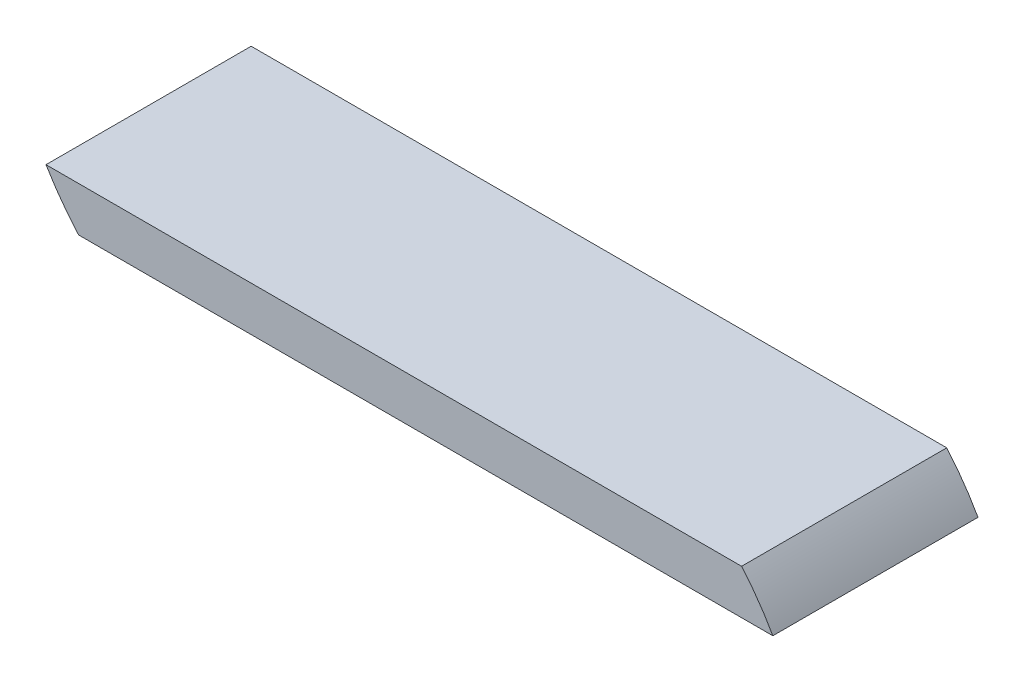
ISO-10303-21;
HEADER;
FILE_DESCRIPTION(('STEP AP214'),'2;1');
FILE_NAME('part.step','',(''),(''),'','','');
FILE_SCHEMA(('AUTOMOTIVE_DESIGN { 1 0 10303 214 1 1 1 1 }'));
ENDSEC;
DATA;
#1=APPLICATION_CONTEXT('core data for automotive mechanical design processes');
#2=APPLICATION_PROTOCOL_DEFINITION('international standard','automotive_design',2000,#1);
#3=PRODUCT_CONTEXT('',#1,'mechanical');
#4=PRODUCT('Part','Part','',(#3));
#5=PRODUCT_RELATED_PRODUCT_CATEGORY('part','',(#4));
#6=PRODUCT_DEFINITION_FORMATION('','',#4);
#7=PRODUCT_DEFINITION_CONTEXT('part definition',#1,'design');
#8=PRODUCT_DEFINITION('design','',#6,#7);
#9=PRODUCT_DEFINITION_SHAPE('','',#8);
#10=(LENGTH_UNIT() NAMED_UNIT(*) SI_UNIT(.MILLI.,.METRE.));
#11=(NAMED_UNIT(*) PLANE_ANGLE_UNIT() SI_UNIT($,.RADIAN.));
#12=(NAMED_UNIT(*) SI_UNIT($,.STERADIAN.) SOLID_ANGLE_UNIT());
#13=UNCERTAINTY_MEASURE_WITH_UNIT(LENGTH_MEASURE(1.E-05),#10,'distance_accuracy_value','');
#14=(GEOMETRIC_REPRESENTATION_CONTEXT(3) GLOBAL_UNCERTAINTY_ASSIGNED_CONTEXT((#13)) GLOBAL_UNIT_ASSIGNED_CONTEXT((#10,
#11,#12)) REPRESENTATION_CONTEXT('',''));
#15=CARTESIAN_POINT('',(0.,0.,0.));
#16=DIRECTION('',(0.,0.,1.));
#17=DIRECTION('',(1.,0.,0.));
#18=AXIS2_PLACEMENT_3D('',#15,#16,#17);
#19=CARTESIAN_POINT('',(-26.695967526266,6.071476226117,0.));
#20=DIRECTION('',(0.,-1.,0.));
#21=DIRECTION('',(1.,0.,0.));
#22=AXIS2_PLACEMENT_3D('',#19,#20,#21);
#23=PLANE('',#22);
#24=DIRECTION('',(1.,0.,0.));
#25=VECTOR('',#24,1.);
#26=CARTESIAN_POINT('',(-26.695967526266,6.071476226117,0.));
#27=LINE('',#26,#25);
#28=CARTESIAN_POINT('',(-26.695967526266,6.071476226117,0.));
#29=VERTEX_POINT('',#28);
#30=CARTESIAN_POINT('',(-26.357587371398,6.071476226117,0.));
#31=VERTEX_POINT('',#30);
#32=EDGE_CURVE('E11',#29,#31,#27,.T.);
#33=ORIENTED_EDGE('',*,*,#32,.T.);
#34=DIRECTION('',(0.,0.,1.));
#35=VECTOR('',#34,1.);
#36=CARTESIAN_POINT('',(-26.357587371398,6.071476226117,0.));
#37=LINE('',#36,#35);
#38=CARTESIAN_POINT('',(-26.357587371398,6.071476226117,0.1));
#39=VERTEX_POINT('',#38);
#40=EDGE_CURVE('E24',#31,#39,#37,.T.);
#41=ORIENTED_EDGE('',*,*,#40,.T.);
#42=DIRECTION('',(1.,0.,0.));
#43=VECTOR('',#42,1.);
#44=CARTESIAN_POINT('',(-26.695967526266,6.071476226117,0.1));
#45=LINE('',#44,#43);
#46=CARTESIAN_POINT('',(-26.695967526266,6.071476226117,0.1));
#47=VERTEX_POINT('',#46);
#48=EDGE_CURVE('E75',#47,#39,#45,.T.);
#49=ORIENTED_EDGE('',*,*,#48,.F.);
#50=DIRECTION('',(0.,0.,1.));
#51=VECTOR('',#50,1.);
#52=CARTESIAN_POINT('',(-26.695967526266,6.071476226117,0.));
#53=LINE('',#52,#51);
#54=EDGE_CURVE('E86',#29,#47,#53,.T.);
#55=ORIENTED_EDGE('',*,*,#54,.F.);
#56=EDGE_LOOP('',(#33,#41,#49,#55));
#57=FACE_BOUND('',#56,.T.);
#58=ADVANCED_FACE('F17',(#57),#23,.T.);
#59=CARTESIAN_POINT('',(-26.590617401597,6.165251438178,0.));
#60=DIRECTION('',(0.,0.,1.));
#61=DIRECTION('',(-0.85968879934598,-0.510818136208051,0.));
#62=AXIS2_PLACEMENT_3D('',#59,#60,#61);
#63=CYLINDRICAL_SURFACE('',#62,0.141040558580501);
#64=CARTESIAN_POINT('',(-26.590617401597,6.165251438178,0.));
#65=DIRECTION('',(0.,0.,1.));
#66=DIRECTION('',(-0.85968879934598,-0.510818136208051,0.));
#67=AXIS2_PLACEMENT_3D('',#64,#65,#66);
#68=CIRCLE('',#67,0.141040558580501);
#69=CARTESIAN_POINT('',(-26.711868390063,6.093205362914,0.));
#70=VERTEX_POINT('',#69);
#71=EDGE_CURVE('E83',#70,#29,#68,.T.);
#72=ORIENTED_EDGE('',*,*,#71,.T.);
#73=ORIENTED_EDGE('',*,*,#54,.T.);
#74=CARTESIAN_POINT('',(-26.590617401597,6.165251438178,0.1));
#75=DIRECTION('',(0.,0.,1.));
#76=DIRECTION('',(-0.85968879934598,-0.510818136208051,0.));
#77=AXIS2_PLACEMENT_3D('',#74,#75,#76);
#78=CIRCLE('',#77,0.141040558580501);
#79=CARTESIAN_POINT('',(-26.711868390063,6.093205362914,0.1));
#80=VERTEX_POINT('',#79);
#81=EDGE_CURVE('E81',#80,#47,#78,.T.);
#82=ORIENTED_EDGE('',*,*,#81,.F.);
#83=DIRECTION('',(0.,0.,1.));
#84=VECTOR('',#83,1.);
#85=CARTESIAN_POINT('',(-26.711868390063,6.093205362914,0.));
#86=LINE('',#85,#84);
#87=EDGE_CURVE('E61',#70,#80,#86,.T.);
#88=ORIENTED_EDGE('',*,*,#87,.F.);
#89=EDGE_LOOP('',(#72,#73,#82,#88));
#90=FACE_BOUND('',#89,.T.);
#91=ADVANCED_FACE('F91',(#90),#63,.T.);
#92=CARTESIAN_POINT('',(-26.372820892748,6.093205362914,0.));
#93=DIRECTION('',(0.,1.,0.));
#94=DIRECTION('',(-1.,0.,0.));
#95=AXIS2_PLACEMENT_3D('',#92,#93,#94);
#96=PLANE('',#95);
#97=DIRECTION('',(-1.,0.,0.));
#98=VECTOR('',#97,1.);
#99=CARTESIAN_POINT('',(-26.372820892748,6.093205362914,0.));
#100=LINE('',#99,#98);
#101=CARTESIAN_POINT('',(-26.372820892748,6.093205362914,0.));
#102=VERTEX_POINT('',#101);
#103=EDGE_CURVE('E65',#102,#70,#100,.T.);
#104=ORIENTED_EDGE('',*,*,#103,.T.);
#105=ORIENTED_EDGE('',*,*,#87,.T.);
#106=DIRECTION('',(-1.,0.,0.));
#107=VECTOR('',#106,1.);
#108=CARTESIAN_POINT('',(-26.372820892748,6.093205362914,0.1));
#109=LINE('',#108,#107);
#110=CARTESIAN_POINT('',(-26.372820892748,6.093205362914,0.1));
#111=VERTEX_POINT('',#110);
#112=EDGE_CURVE('E54',#111,#80,#109,.T.);
#113=ORIENTED_EDGE('',*,*,#112,.F.);
#114=DIRECTION('',(0.,0.,1.));
#115=VECTOR('',#114,1.);
#116=CARTESIAN_POINT('',(-26.372820892748,6.093205362914,0.));
#117=LINE('',#116,#115);
#118=EDGE_CURVE('E58',#102,#111,#117,.T.);
#119=ORIENTED_EDGE('',*,*,#118,.F.);
#120=EDGE_LOOP('',(#104,#105,#113,#119));
#121=FACE_BOUND('',#120,.T.);
#122=ADVANCED_FACE('F57',(#121),#96,.T.);
#123=CARTESIAN_POINT('',(-26.474240487687,6.005899301844,0.));
#124=DIRECTION('',(0.,0.,1.));
#125=DIRECTION('',(0.871704677336867,0.490031586236059,0.));
#126=AXIS2_PLACEMENT_3D('',#123,#124,#125);
#127=CYLINDRICAL_SURFACE('',#126,0.133821831316658);
#128=CARTESIAN_POINT('',(-26.474240487687,6.005899301844,0.));
#129=DIRECTION('',(0.,0.,1.));
#130=DIRECTION('',(0.871704677336867,0.490031586236059,0.));
#131=AXIS2_PLACEMENT_3D('',#128,#129,#130);
#132=CIRCLE('',#131,0.133821831316658);
#133=EDGE_CURVE('E71',#31,#102,#132,.T.);
#134=ORIENTED_EDGE('',*,*,#133,.T.);
#135=ORIENTED_EDGE('',*,*,#118,.T.);
#136=CARTESIAN_POINT('',(-26.474240487687,6.005899301844,0.1));
#137=DIRECTION('',(0.,0.,1.));
#138=DIRECTION('',(0.871704677336867,0.490031586236059,0.));
#139=AXIS2_PLACEMENT_3D('',#136,#137,#138);
#140=CIRCLE('',#139,0.133821831316658);
#141=EDGE_CURVE('E70',#39,#111,#140,.T.);
#142=ORIENTED_EDGE('',*,*,#141,.F.);
#143=ORIENTED_EDGE('',*,*,#40,.F.);
#144=EDGE_LOOP('',(#134,#135,#142,#143));
#145=FACE_BOUND('',#144,.T.);
#146=ADVANCED_FACE('F69',(#145),#127,.T.);
#147=CARTESIAN_POINT('',(-26.534636376045,6.082350762997,0.1));
#148=DIRECTION('',(0.,0.,1.));
#149=DIRECTION('',(1.,0.,0.));
#150=AXIS2_PLACEMENT_3D('',#147,#148,#149);
#151=PLANE('',#150);
#152=ORIENTED_EDGE('',*,*,#141,.T.);
#153=ORIENTED_EDGE('',*,*,#112,.T.);
#154=ORIENTED_EDGE('',*,*,#81,.T.);
#155=ORIENTED_EDGE('',*,*,#48,.T.);
#156=EDGE_LOOP('',(#152,#153,#154,#155));
#157=FACE_BOUND('',#156,.T.);
#158=ADVANCED_FACE('F74',(#157),#151,.T.);
#159=CARTESIAN_POINT('',(-26.534636376045,6.082350762997,0.));
#160=DIRECTION('',(0.,0.,1.));
#161=DIRECTION('',(1.,0.,0.));
#162=AXIS2_PLACEMENT_3D('',#159,#160,#161);
#163=PLANE('',#162);
#164=ORIENTED_EDGE('',*,*,#133,.F.);
#165=ORIENTED_EDGE('',*,*,#32,.F.);
#166=ORIENTED_EDGE('',*,*,#71,.F.);
#167=ORIENTED_EDGE('',*,*,#103,.F.);
#168=EDGE_LOOP('',(#164,#165,#166,#167));
#169=FACE_BOUND('',#168,.T.);
#170=ADVANCED_FACE('F89',(#169),#163,.F.);
#171=CLOSED_SHELL('',(#58,#91,#122,#146,#158,#170));
#172=MANIFOLD_SOLID_BREP('B1',#171);
#173=ADVANCED_BREP_SHAPE_REPRESENTATION('',(#18,#172),#14);
#174=SHAPE_DEFINITION_REPRESENTATION(#9,#173);
ENDSEC;
END-ISO-10303-21;
